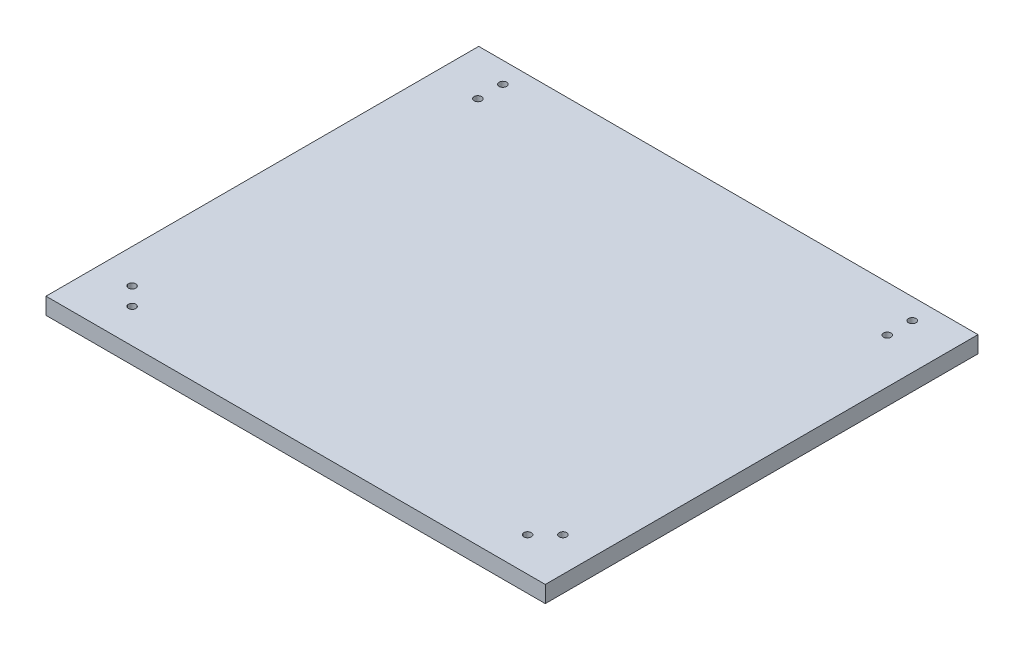
ISO-10303-21;
HEADER;
FILE_DESCRIPTION(('STEP AP214'),'2;1');
FILE_NAME('part.step','',(''),(''),'','','');
FILE_SCHEMA(('AUTOMOTIVE_DESIGN { 1 0 10303 214 1 1 1 1 }'));
ENDSEC;
DATA;
#1=APPLICATION_CONTEXT('core data for automotive mechanical design processes');
#2=APPLICATION_PROTOCOL_DEFINITION('international standard','automotive_design',2000,#1);
#3=PRODUCT_CONTEXT('',#1,'mechanical');
#4=PRODUCT('Part','Part','',(#3));
#5=PRODUCT_RELATED_PRODUCT_CATEGORY('part','',(#4));
#6=PRODUCT_DEFINITION_FORMATION('','',#4);
#7=PRODUCT_DEFINITION_CONTEXT('part definition',#1,'design');
#8=PRODUCT_DEFINITION('design','',#6,#7);
#9=PRODUCT_DEFINITION_SHAPE('','',#8);
#10=(LENGTH_UNIT() NAMED_UNIT(*) SI_UNIT(.MILLI.,.METRE.));
#11=(NAMED_UNIT(*) PLANE_ANGLE_UNIT() SI_UNIT($,.RADIAN.));
#12=(NAMED_UNIT(*) SI_UNIT($,.STERADIAN.) SOLID_ANGLE_UNIT());
#13=UNCERTAINTY_MEASURE_WITH_UNIT(LENGTH_MEASURE(1.E-05),#10,'distance_accuracy_value','');
#14=(GEOMETRIC_REPRESENTATION_CONTEXT(3) GLOBAL_UNCERTAINTY_ASSIGNED_CONTEXT((#13)) GLOBAL_UNIT_ASSIGNED_CONTEXT((#10,
#11,#12)) REPRESENTATION_CONTEXT('',''));
#15=CARTESIAN_POINT('',(0.,0.,0.));
#16=DIRECTION('',(0.,0.,1.));
#17=DIRECTION('',(1.,0.,0.));
#18=AXIS2_PLACEMENT_3D('',#15,#16,#17);
#19=CARTESIAN_POINT('',(0.,10.,0.));
#20=DIRECTION('',(-1.,0.,0.));
#21=DIRECTION('',(0.,0.,1.));
#22=AXIS2_PLACEMENT_3D('',#19,#20,#21);
#23=PLANE('',#22);
#24=DIRECTION('',(0.,0.,-1.));
#25=VECTOR('',#24,1.);
#26=CARTESIAN_POINT('',(0.,0.,0.));
#27=LINE('',#26,#25);
#28=CARTESIAN_POINT('',(0.,0.,0.));
#29=VERTEX_POINT('',#28);
#30=CARTESIAN_POINT('',(0.,0.,-260.));
#31=VERTEX_POINT('',#30);
#32=EDGE_CURVE('E100',#29,#31,#27,.T.);
#33=ORIENTED_EDGE('',*,*,#32,.T.);
#34=DIRECTION('',(0.,-1.,0.));
#35=VECTOR('',#34,1.);
#36=CARTESIAN_POINT('',(0.,10.,-260.));
#37=LINE('',#36,#35);
#38=CARTESIAN_POINT('',(0.,10.,-260.));
#39=VERTEX_POINT('',#38);
#40=EDGE_CURVE('E11',#39,#31,#37,.T.);
#41=ORIENTED_EDGE('',*,*,#40,.F.);
#42=DIRECTION('',(0.,0.,-1.));
#43=VECTOR('',#42,1.);
#44=CARTESIAN_POINT('',(0.,10.,0.));
#45=LINE('',#44,#43);
#46=CARTESIAN_POINT('',(0.,10.,0.));
#47=VERTEX_POINT('',#46);
#48=EDGE_CURVE('E88',#47,#39,#45,.T.);
#49=ORIENTED_EDGE('',*,*,#48,.F.);
#50=DIRECTION('',(0.,-1.,0.));
#51=VECTOR('',#50,1.);
#52=CARTESIAN_POINT('',(0.,10.,0.));
#53=LINE('',#52,#51);
#54=EDGE_CURVE('E96',#47,#29,#53,.T.);
#55=ORIENTED_EDGE('',*,*,#54,.T.);
#56=EDGE_LOOP('',(#33,#41,#49,#55));
#57=FACE_BOUND('',#56,.T.);
#58=ADVANCED_FACE('F37',(#57),#23,.F.);
#59=CARTESIAN_POINT('',(0.,10.,-260.));
#60=DIRECTION('',(0.,0.,1.));
#61=DIRECTION('',(1.,0.,0.));
#62=AXIS2_PLACEMENT_3D('',#59,#60,#61);
#63=PLANE('',#62);
#64=DIRECTION('',(-1.,0.,0.));
#65=VECTOR('',#64,1.);
#66=CARTESIAN_POINT('',(0.,0.,-260.));
#67=LINE('',#66,#65);
#68=CARTESIAN_POINT('',(-300.,0.,-260.));
#69=VERTEX_POINT('',#68);
#70=EDGE_CURVE('E92',#31,#69,#67,.T.);
#71=ORIENTED_EDGE('',*,*,#70,.T.);
#72=DIRECTION('',(0.,-1.,0.));
#73=VECTOR('',#72,1.);
#74=CARTESIAN_POINT('',(-300.,10.,-260.));
#75=LINE('',#74,#73);
#76=CARTESIAN_POINT('',(-300.,10.,-260.));
#77=VERTEX_POINT('',#76);
#78=EDGE_CURVE('E45',#77,#69,#75,.T.);
#79=ORIENTED_EDGE('',*,*,#78,.F.);
#80=DIRECTION('',(-1.,0.,0.));
#81=VECTOR('',#80,1.);
#82=CARTESIAN_POINT('',(0.,10.,-260.));
#83=LINE('',#82,#81);
#84=EDGE_CURVE('E83',#39,#77,#83,.T.);
#85=ORIENTED_EDGE('',*,*,#84,.F.);
#86=ORIENTED_EDGE('',*,*,#40,.T.);
#87=EDGE_LOOP('',(#71,#79,#85,#86));
#88=FACE_BOUND('',#87,.T.);
#89=ADVANCED_FACE('F91',(#88),#63,.F.);
#90=CARTESIAN_POINT('',(-300.,10.,0.));
#91=DIRECTION('',(1.,0.,0.));
#92=DIRECTION('',(0.,0.,-1.));
#93=AXIS2_PLACEMENT_3D('',#90,#91,#92);
#94=PLANE('',#93);
#95=DIRECTION('',(0.,0.,1.));
#96=VECTOR('',#95,1.);
#97=CARTESIAN_POINT('',(-300.,0.,0.));
#98=LINE('',#97,#96);
#99=CARTESIAN_POINT('',(-300.,0.,0.));
#100=VERTEX_POINT('',#99);
#101=EDGE_CURVE('E70',#69,#100,#98,.T.);
#102=ORIENTED_EDGE('',*,*,#101,.T.);
#103=DIRECTION('',(0.,-1.,0.));
#104=VECTOR('',#103,1.);
#105=CARTESIAN_POINT('',(-300.,10.,0.));
#106=LINE('',#105,#104);
#107=CARTESIAN_POINT('',(-300.,10.,0.));
#108=VERTEX_POINT('',#107);
#109=EDGE_CURVE('E93',#108,#100,#106,.T.);
#110=ORIENTED_EDGE('',*,*,#109,.F.);
#111=DIRECTION('',(0.,0.,1.));
#112=VECTOR('',#111,1.);
#113=CARTESIAN_POINT('',(-300.,10.,0.));
#114=LINE('',#113,#112);
#115=EDGE_CURVE('E86',#77,#108,#114,.T.);
#116=ORIENTED_EDGE('',*,*,#115,.F.);
#117=ORIENTED_EDGE('',*,*,#78,.T.);
#118=EDGE_LOOP('',(#102,#110,#116,#117));
#119=FACE_BOUND('',#118,.T.);
#120=ADVANCED_FACE('F94',(#119),#94,.F.);
#121=CARTESIAN_POINT('',(0.,10.,0.));
#122=DIRECTION('',(0.,0.,-1.));
#123=DIRECTION('',(-1.,0.,0.));
#124=AXIS2_PLACEMENT_3D('',#121,#122,#123);
#125=PLANE('',#124);
#126=DIRECTION('',(1.,0.,0.));
#127=VECTOR('',#126,1.);
#128=CARTESIAN_POINT('',(0.,0.,0.));
#129=LINE('',#128,#127);
#130=EDGE_CURVE('E76',#100,#29,#129,.T.);
#131=ORIENTED_EDGE('',*,*,#130,.T.);
#132=ORIENTED_EDGE('',*,*,#54,.F.);
#133=DIRECTION('',(1.,0.,0.));
#134=VECTOR('',#133,1.);
#135=CARTESIAN_POINT('',(0.,10.,0.));
#136=LINE('',#135,#134);
#137=EDGE_CURVE('E53',#108,#47,#136,.T.);
#138=ORIENTED_EDGE('',*,*,#137,.F.);
#139=ORIENTED_EDGE('',*,*,#109,.T.);
#140=EDGE_LOOP('',(#131,#132,#138,#139));
#141=FACE_BOUND('',#140,.T.);
#142=ADVANCED_FACE('F108',(#141),#125,.F.);
#143=CARTESIAN_POINT('',(0.,10.,0.));
#144=DIRECTION('',(0.,1.,0.));
#145=DIRECTION('',(0.,0.,1.));
#146=AXIS2_PLACEMENT_3D('',#143,#144,#145);
#147=PLANE('',#146);
#148=CARTESIAN_POINT('',(-273.,10.,-247.5));
#149=DIRECTION('',(0.,1.,0.));
#150=DIRECTION('',(0.,0.,1.));
#151=AXIS2_PLACEMENT_3D('',#148,#149,#150);
#152=CIRCLE('',#151,2.24999999999996);
#153=CARTESIAN_POINT('',(-273.,10.,-245.25));
#154=VERTEX_POINT('',#153);
#155=EDGE_CURVE('E135',#154,#154,#152,.T.);
#156=ORIENTED_EDGE('',*,*,#155,.F.);
#157=EDGE_LOOP('',(#156));
#158=FACE_BOUND('',#157,.T.);
#159=CARTESIAN_POINT('',(-31.1611652351682,10.,-20.5545635173699));
#160=DIRECTION('',(0.,1.,0.));
#161=DIRECTION('',(0.,0.,1.));
#162=AXIS2_PLACEMENT_3D('',#159,#160,#161);
#163=CIRCLE('',#162,2.25);
#164=CARTESIAN_POINT('',(-31.1611652351682,10.,-18.3045635173699));
#165=VERTEX_POINT('',#164);
#166=EDGE_CURVE('E124',#165,#165,#163,.T.);
#167=ORIENTED_EDGE('',*,*,#166,.F.);
#168=EDGE_LOOP('',(#167));
#169=FACE_BOUND('',#168,.T.);
#170=CARTESIAN_POINT('',(-20.55456351737,10.,-31.1611652351681));
#171=DIRECTION('',(0.,1.,0.));
#172=DIRECTION('',(0.,0.,1.));
#173=AXIS2_PLACEMENT_3D('',#170,#171,#172);
#174=CIRCLE('',#173,2.25);
#175=CARTESIAN_POINT('',(-20.55456351737,10.,-28.9111652351681));
#176=VERTEX_POINT('',#175);
#177=EDGE_CURVE('E123',#176,#176,#174,.T.);
#178=ORIENTED_EDGE('',*,*,#177,.F.);
#179=EDGE_LOOP('',(#178));
#180=FACE_BOUND('',#179,.T.);
#181=CARTESIAN_POINT('',(-279.44543648263,10.,-31.1611652351681));
#182=DIRECTION('',(0.,1.,0.));
#183=DIRECTION('',(0.,0.,1.));
#184=AXIS2_PLACEMENT_3D('',#181,#182,#183);
#185=CIRCLE('',#184,2.24999999999995);
#186=CARTESIAN_POINT('',(-279.44543648263,10.,-28.9111652351682));
#187=VERTEX_POINT('',#186);
#188=EDGE_CURVE('E117',#187,#187,#185,.T.);
#189=ORIENTED_EDGE('',*,*,#188,.F.);
#190=EDGE_LOOP('',(#189));
#191=FACE_BOUND('',#190,.T.);
#192=CARTESIAN_POINT('',(-273.,10.,-232.5));
#193=DIRECTION('',(0.,1.,0.));
#194=DIRECTION('',(0.,0.,1.));
#195=AXIS2_PLACEMENT_3D('',#192,#193,#194);
#196=CIRCLE('',#195,2.24999999999996);
#197=CARTESIAN_POINT('',(-273.,10.,-230.25));
#198=VERTEX_POINT('',#197);
#199=EDGE_CURVE('E136',#198,#198,#196,.T.);
#200=ORIENTED_EDGE('',*,*,#199,.F.);
#201=EDGE_LOOP('',(#200));
#202=FACE_BOUND('',#201,.T.);
#203=CARTESIAN_POINT('',(-27.,10.,-232.5));
#204=DIRECTION('',(0.,1.,0.));
#205=DIRECTION('',(0.,0.,1.));
#206=AXIS2_PLACEMENT_3D('',#203,#204,#205);
#207=CIRCLE('',#206,2.25);
#208=CARTESIAN_POINT('',(-27.,10.,-230.25));
#209=VERTEX_POINT('',#208);
#210=EDGE_CURVE('E153',#209,#209,#207,.T.);
#211=ORIENTED_EDGE('',*,*,#210,.F.);
#212=EDGE_LOOP('',(#211));
#213=FACE_BOUND('',#212,.T.);
#214=CARTESIAN_POINT('',(-27.,10.,-247.5));
#215=DIRECTION('',(0.,1.,0.));
#216=DIRECTION('',(0.,0.,1.));
#217=AXIS2_PLACEMENT_3D('',#214,#215,#216);
#218=CIRCLE('',#217,2.25);
#219=CARTESIAN_POINT('',(-27.,10.,-245.25));
#220=VERTEX_POINT('',#219);
#221=EDGE_CURVE('E147',#220,#220,#218,.T.);
#222=ORIENTED_EDGE('',*,*,#221,.F.);
#223=EDGE_LOOP('',(#222));
#224=FACE_BOUND('',#223,.T.);
#225=CARTESIAN_POINT('',(-268.838834764832,10.,-20.5545635173699));
#226=DIRECTION('',(0.,1.,0.));
#227=DIRECTION('',(0.,0.,1.));
#228=AXIS2_PLACEMENT_3D('',#225,#226,#227);
#229=CIRCLE('',#228,2.24999999999995);
#230=CARTESIAN_POINT('',(-268.838834764832,10.,-18.30456351737));
#231=VERTEX_POINT('',#230);
#232=EDGE_CURVE('E114',#231,#231,#229,.T.);
#233=ORIENTED_EDGE('',*,*,#232,.F.);
#234=EDGE_LOOP('',(#233));
#235=FACE_BOUND('',#234,.T.);
#236=ORIENTED_EDGE('',*,*,#48,.T.);
#237=ORIENTED_EDGE('',*,*,#84,.T.);
#238=ORIENTED_EDGE('',*,*,#115,.T.);
#239=ORIENTED_EDGE('',*,*,#137,.T.);
#240=EDGE_LOOP('',(#236,#237,#238,#239));
#241=FACE_BOUND('',#240,.T.);
#242=ADVANCED_FACE('F84',(#158,#169,#180,#191,#202,#213,#224,#235,#241),#147,.T.);
#243=CARTESIAN_POINT('',(0.,0.,0.));
#244=DIRECTION('',(0.,1.,0.));
#245=DIRECTION('',(0.,0.,1.));
#246=AXIS2_PLACEMENT_3D('',#243,#244,#245);
#247=PLANE('',#246);
#248=CARTESIAN_POINT('',(-273.,0.,-247.5));
#249=DIRECTION('',(0.,1.,0.));
#250=DIRECTION('',(0.,0.,1.));
#251=AXIS2_PLACEMENT_3D('',#248,#249,#250);
#252=CIRCLE('',#251,2.24999999999996);
#253=CARTESIAN_POINT('',(-273.,0.,-245.25));
#254=VERTEX_POINT('',#253);
#255=EDGE_CURVE('E132',#254,#254,#252,.T.);
#256=ORIENTED_EDGE('',*,*,#255,.T.);
#257=EDGE_LOOP('',(#256));
#258=FACE_BOUND('',#257,.T.);
#259=CARTESIAN_POINT('',(-31.1611652351682,0.,-20.5545635173699));
#260=DIRECTION('',(0.,1.,0.));
#261=DIRECTION('',(0.,0.,1.));
#262=AXIS2_PLACEMENT_3D('',#259,#260,#261);
#263=CIRCLE('',#262,2.25);
#264=CARTESIAN_POINT('',(-31.1611652351682,0.,-18.3045635173699));
#265=VERTEX_POINT('',#264);
#266=EDGE_CURVE('E139',#265,#265,#263,.T.);
#267=ORIENTED_EDGE('',*,*,#266,.T.);
#268=EDGE_LOOP('',(#267));
#269=FACE_BOUND('',#268,.T.);
#270=CARTESIAN_POINT('',(-20.55456351737,0.,-31.1611652351681));
#271=DIRECTION('',(0.,1.,0.));
#272=DIRECTION('',(0.,0.,1.));
#273=AXIS2_PLACEMENT_3D('',#270,#271,#272);
#274=CIRCLE('',#273,2.25);
#275=CARTESIAN_POINT('',(-20.55456351737,0.,-28.9111652351681));
#276=VERTEX_POINT('',#275);
#277=EDGE_CURVE('E120',#276,#276,#274,.T.);
#278=ORIENTED_EDGE('',*,*,#277,.T.);
#279=EDGE_LOOP('',(#278));
#280=FACE_BOUND('',#279,.T.);
#281=CARTESIAN_POINT('',(-279.44543648263,0.,-31.1611652351681));
#282=DIRECTION('',(0.,1.,0.));
#283=DIRECTION('',(0.,0.,1.));
#284=AXIS2_PLACEMENT_3D('',#281,#282,#283);
#285=CIRCLE('',#284,2.24999999999995);
#286=CARTESIAN_POINT('',(-279.44543648263,0.,-28.9111652351682));
#287=VERTEX_POINT('',#286);
#288=EDGE_CURVE('E127',#287,#287,#285,.T.);
#289=ORIENTED_EDGE('',*,*,#288,.T.);
#290=EDGE_LOOP('',(#289));
#291=FACE_BOUND('',#290,.T.);
#292=CARTESIAN_POINT('',(-273.,0.,-232.5));
#293=DIRECTION('',(0.,1.,0.));
#294=DIRECTION('',(0.,0.,1.));
#295=AXIS2_PLACEMENT_3D('',#292,#293,#294);
#296=CIRCLE('',#295,2.24999999999996);
#297=CARTESIAN_POINT('',(-273.,0.,-230.25));
#298=VERTEX_POINT('',#297);
#299=EDGE_CURVE('E156',#298,#298,#296,.T.);
#300=ORIENTED_EDGE('',*,*,#299,.T.);
#301=EDGE_LOOP('',(#300));
#302=FACE_BOUND('',#301,.T.);
#303=CARTESIAN_POINT('',(-27.,0.,-232.5));
#304=DIRECTION('',(0.,1.,0.));
#305=DIRECTION('',(0.,0.,1.));
#306=AXIS2_PLACEMENT_3D('',#303,#304,#305);
#307=CIRCLE('',#306,2.25);
#308=CARTESIAN_POINT('',(-27.,0.,-230.25));
#309=VERTEX_POINT('',#308);
#310=EDGE_CURVE('E150',#309,#309,#307,.T.);
#311=ORIENTED_EDGE('',*,*,#310,.T.);
#312=EDGE_LOOP('',(#311));
#313=FACE_BOUND('',#312,.T.);
#314=CARTESIAN_POINT('',(-27.,0.,-247.5));
#315=DIRECTION('',(0.,1.,0.));
#316=DIRECTION('',(0.,0.,1.));
#317=AXIS2_PLACEMENT_3D('',#314,#315,#316);
#318=CIRCLE('',#317,2.25);
#319=CARTESIAN_POINT('',(-27.,0.,-245.25));
#320=VERTEX_POINT('',#319);
#321=EDGE_CURVE('E144',#320,#320,#318,.T.);
#322=ORIENTED_EDGE('',*,*,#321,.T.);
#323=EDGE_LOOP('',(#322));
#324=FACE_BOUND('',#323,.T.);
#325=CARTESIAN_POINT('',(-268.838834764832,0.,-20.5545635173699));
#326=DIRECTION('',(0.,1.,0.));
#327=DIRECTION('',(0.,0.,1.));
#328=AXIS2_PLACEMENT_3D('',#325,#326,#327);
#329=CIRCLE('',#328,2.24999999999995);
#330=CARTESIAN_POINT('',(-268.838834764832,0.,-18.30456351737));
#331=VERTEX_POINT('',#330);
#332=EDGE_CURVE('E103',#331,#331,#329,.T.);
#333=ORIENTED_EDGE('',*,*,#332,.T.);
#334=EDGE_LOOP('',(#333));
#335=FACE_BOUND('',#334,.T.);
#336=ORIENTED_EDGE('',*,*,#32,.F.);
#337=ORIENTED_EDGE('',*,*,#130,.F.);
#338=ORIENTED_EDGE('',*,*,#101,.F.);
#339=ORIENTED_EDGE('',*,*,#70,.F.);
#340=EDGE_LOOP('',(#336,#337,#338,#339));
#341=FACE_BOUND('',#340,.T.);
#342=ADVANCED_FACE('F111',(#258,#269,#280,#291,#302,#313,#324,#335,#341),#247,.F.);
#343=CARTESIAN_POINT('',(-268.838834764832,0.,-20.5545635173699));
#344=DIRECTION('',(0.,1.,0.));
#345=DIRECTION('',(0.,0.,1.));
#346=AXIS2_PLACEMENT_3D('',#343,#344,#345);
#347=CYLINDRICAL_SURFACE('',#346,2.24999999999995);
#348=ORIENTED_EDGE('',*,*,#332,.F.);
#349=EDGE_LOOP('',(#348));
#350=FACE_BOUND('',#349,.T.);
#351=ORIENTED_EDGE('',*,*,#232,.T.);
#352=EDGE_LOOP('',(#351));
#353=FACE_BOUND('',#352,.T.);
#354=ADVANCED_FACE('F174',(#350,#353),#347,.F.);
#355=CARTESIAN_POINT('',(-27.,0.,-247.5));
#356=DIRECTION('',(0.,1.,0.));
#357=DIRECTION('',(0.,0.,1.));
#358=AXIS2_PLACEMENT_3D('',#355,#356,#357);
#359=CYLINDRICAL_SURFACE('',#358,2.25);
#360=ORIENTED_EDGE('',*,*,#321,.F.);
#361=EDGE_LOOP('',(#360));
#362=FACE_BOUND('',#361,.T.);
#363=ORIENTED_EDGE('',*,*,#221,.T.);
#364=EDGE_LOOP('',(#363));
#365=FACE_BOUND('',#364,.T.);
#366=ADVANCED_FACE('F176',(#362,#365),#359,.F.);
#367=CARTESIAN_POINT('',(-27.,0.,-232.5));
#368=DIRECTION('',(0.,1.,0.));
#369=DIRECTION('',(0.,0.,1.));
#370=AXIS2_PLACEMENT_3D('',#367,#368,#369);
#371=CYLINDRICAL_SURFACE('',#370,2.25);
#372=ORIENTED_EDGE('',*,*,#310,.F.);
#373=EDGE_LOOP('',(#372));
#374=FACE_BOUND('',#373,.T.);
#375=ORIENTED_EDGE('',*,*,#210,.T.);
#376=EDGE_LOOP('',(#375));
#377=FACE_BOUND('',#376,.T.);
#378=ADVANCED_FACE('F183',(#374,#377),#371,.F.);
#379=CARTESIAN_POINT('',(-273.,0.,-232.5));
#380=DIRECTION('',(0.,1.,0.));
#381=DIRECTION('',(0.,0.,1.));
#382=AXIS2_PLACEMENT_3D('',#379,#380,#381);
#383=CYLINDRICAL_SURFACE('',#382,2.24999999999996);
#384=ORIENTED_EDGE('',*,*,#299,.F.);
#385=EDGE_LOOP('',(#384));
#386=FACE_BOUND('',#385,.T.);
#387=ORIENTED_EDGE('',*,*,#199,.T.);
#388=EDGE_LOOP('',(#387));
#389=FACE_BOUND('',#388,.T.);
#390=ADVANCED_FACE('F162',(#386,#389),#383,.F.);
#391=CARTESIAN_POINT('',(-279.44543648263,0.,-31.1611652351681));
#392=DIRECTION('',(0.,1.,0.));
#393=DIRECTION('',(0.,0.,1.));
#394=AXIS2_PLACEMENT_3D('',#391,#392,#393);
#395=CYLINDRICAL_SURFACE('',#394,2.24999999999995);
#396=ORIENTED_EDGE('',*,*,#288,.F.);
#397=EDGE_LOOP('',(#396));
#398=FACE_BOUND('',#397,.T.);
#399=ORIENTED_EDGE('',*,*,#188,.T.);
#400=EDGE_LOOP('',(#399));
#401=FACE_BOUND('',#400,.T.);
#402=ADVANCED_FACE('F244',(#398,#401),#395,.F.);
#403=CARTESIAN_POINT('',(-20.55456351737,0.,-31.1611652351681));
#404=DIRECTION('',(0.,1.,0.));
#405=DIRECTION('',(0.,0.,1.));
#406=AXIS2_PLACEMENT_3D('',#403,#404,#405);
#407=CYLINDRICAL_SURFACE('',#406,2.25);
#408=ORIENTED_EDGE('',*,*,#277,.F.);
#409=EDGE_LOOP('',(#408));
#410=FACE_BOUND('',#409,.T.);
#411=ORIENTED_EDGE('',*,*,#177,.T.);
#412=EDGE_LOOP('',(#411));
#413=FACE_BOUND('',#412,.T.);
#414=ADVANCED_FACE('F255',(#410,#413),#407,.F.);
#415=CARTESIAN_POINT('',(-31.1611652351682,0.,-20.5545635173699));
#416=DIRECTION('',(0.,1.,0.));
#417=DIRECTION('',(0.,0.,1.));
#418=AXIS2_PLACEMENT_3D('',#415,#416,#417);
#419=CYLINDRICAL_SURFACE('',#418,2.25);
#420=ORIENTED_EDGE('',*,*,#266,.F.);
#421=EDGE_LOOP('',(#420));
#422=FACE_BOUND('',#421,.T.);
#423=ORIENTED_EDGE('',*,*,#166,.T.);
#424=EDGE_LOOP('',(#423));
#425=FACE_BOUND('',#424,.T.);
#426=ADVANCED_FACE('F266',(#422,#425),#419,.F.);
#427=CARTESIAN_POINT('',(-273.,0.,-247.5));
#428=DIRECTION('',(0.,1.,0.));
#429=DIRECTION('',(0.,0.,1.));
#430=AXIS2_PLACEMENT_3D('',#427,#428,#429);
#431=CYLINDRICAL_SURFACE('',#430,2.24999999999996);
#432=ORIENTED_EDGE('',*,*,#255,.F.);
#433=EDGE_LOOP('',(#432));
#434=FACE_BOUND('',#433,.T.);
#435=ORIENTED_EDGE('',*,*,#155,.T.);
#436=EDGE_LOOP('',(#435));
#437=FACE_BOUND('',#436,.T.);
#438=ADVANCED_FACE('F276',(#434,#437),#431,.F.);
#439=CLOSED_SHELL('',(#58,#89,#120,#142,#242,#342,#354,#366,#378,#390,#402,#414,#426,#438));
#440=MANIFOLD_SOLID_BREP('B2',#439);
#441=ADVANCED_BREP_SHAPE_REPRESENTATION('',(#18,#440),#14);
#442=SHAPE_DEFINITION_REPRESENTATION(#9,#441);
ENDSEC;
END-ISO-10303-21;
